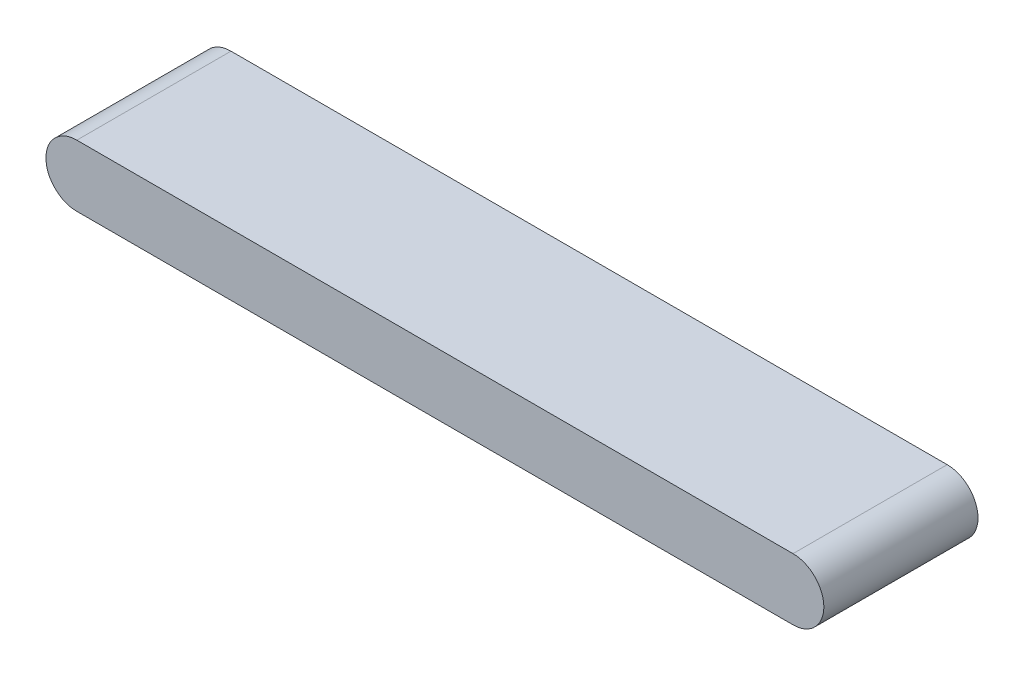
ISO-10303-21;
HEADER;
FILE_DESCRIPTION(('STEP AP214'),'2;1');
FILE_NAME('part.step','',(''),(''),'','','');
FILE_SCHEMA(('AUTOMOTIVE_DESIGN { 1 0 10303 214 1 1 1 1 }'));
ENDSEC;
DATA;
#1=APPLICATION_CONTEXT('core data for automotive mechanical design processes');
#2=APPLICATION_PROTOCOL_DEFINITION('international standard','automotive_design',2000,#1);
#3=PRODUCT_CONTEXT('',#1,'mechanical');
#4=PRODUCT('Part','Part','',(#3));
#5=PRODUCT_RELATED_PRODUCT_CATEGORY('part','',(#4));
#6=PRODUCT_DEFINITION_FORMATION('','',#4);
#7=PRODUCT_DEFINITION_CONTEXT('part definition',#1,'design');
#8=PRODUCT_DEFINITION('design','',#6,#7);
#9=PRODUCT_DEFINITION_SHAPE('','',#8);
#10=(LENGTH_UNIT() NAMED_UNIT(*) SI_UNIT(.MILLI.,.METRE.));
#11=(NAMED_UNIT(*) PLANE_ANGLE_UNIT() SI_UNIT($,.RADIAN.));
#12=(NAMED_UNIT(*) SI_UNIT($,.STERADIAN.) SOLID_ANGLE_UNIT());
#13=UNCERTAINTY_MEASURE_WITH_UNIT(LENGTH_MEASURE(1.E-05),#10,'distance_accuracy_value','');
#14=(GEOMETRIC_REPRESENTATION_CONTEXT(3) GLOBAL_UNCERTAINTY_ASSIGNED_CONTEXT((#13)) GLOBAL_UNIT_ASSIGNED_CONTEXT((#10,
#11,#12)) REPRESENTATION_CONTEXT('',''));
#15=CARTESIAN_POINT('',(0.,0.,0.));
#16=DIRECTION('',(0.,0.,1.));
#17=DIRECTION('',(1.,0.,0.));
#18=AXIS2_PLACEMENT_3D('',#15,#16,#17);
#19=CARTESIAN_POINT('',(145.46078625973,16.026778733944,1.974998392004));
#20=DIRECTION('',(-8.74227339409097E-08,0.,-1.));
#21=DIRECTION('',(-4.371138828674E-08,1.,0.));
#22=AXIS2_PLACEMENT_3D('',#19,#20,#21);
#23=CYLINDRICAL_SURFACE('',#22,0.15);
#24=CARTESIAN_POINT('',(145.46078625318,16.176778733944,1.97499839200438));
#25=CARTESIAN_POINT('',(145.398977588499,16.1767787312423,1.97499839740786));
#26=CARTESIAN_POINT('',(145.354720237919,16.1328447464892,1.97499840127696));
#27=CARTESIAN_POINT('',(145.311016089068,16.0894599215023,1.9749984050977));
#28=CARTESIAN_POINT('',(145.31078625973,16.0267787273906,1.97499840511779));
#29=CARTESIAN_POINT('',(145.31056046366,15.9651975234226,1.97499840513753));
#30=CARTESIAN_POINT('',(145.354720247187,15.9207127121309,1.97499840127696));
#31=CARTESIAN_POINT('',(145.398333224976,15.8767787312141,1.9749983974642));
#32=CARTESIAN_POINT('',(145.460786266287,15.876778733944,1.97499839200438));
#33=B_SPLINE_CURVE_WITH_KNOTS('',2,(#24,#25,#26,#27,#28,#29,#30,#31,#32),.UNSPECIFIED.,.F.,.F.,
(3,2,2,2,3),(0.,0.25,0.5,0.75,1.),.UNSPECIFIED.);
#34=CARTESIAN_POINT('',(145.460786253178,16.1767787339443,1.97499839200419));
#35=VERTEX_POINT('',#34);
#36=CARTESIAN_POINT('',(145.460786266289,15.8767787339443,1.97499839200419));
#37=VERTEX_POINT('',#36);
#38=EDGE_CURVE('E88',#35,#37,#33,.T.);
#39=ORIENTED_EDGE('',*,*,#38,.F.);
#40=CARTESIAN_POINT('',(145.460786253173,16.176778733944,1.974998392004));
#41=DIRECTION('',(-8.74227357172682E-08,0.,-0.999999999999996));
#42=VECTOR('',#41,1.);
#43=LINE('',#40,#42);
#44=CARTESIAN_POINT('',(145.460786187609,16.1767787339443,1.22499839200419));
#45=VERTEX_POINT('',#44);
#46=EDGE_CURVE('E64',#35,#45,#43,.T.);
#47=ORIENTED_EDGE('',*,*,#46,.T.);
#48=CARTESIAN_POINT('',(145.460786194163,16.026778733944,1.22499839200399));
#49=DIRECTION('',(8.74227339409097E-08,0.,1.));
#50=DIRECTION('',(-4.37113308511998E-08,0.999999999999999,0.));
#51=AXIS2_PLACEMENT_3D('',#48,#49,#50);
#52=CIRCLE('',#51,0.150000000000001);
#53=CARTESIAN_POINT('',(145.46078620072,15.8767787339443,1.22499839200419));
#54=VERTEX_POINT('',#53);
#55=EDGE_CURVE('E57',#45,#54,#52,.T.);
#56=ORIENTED_EDGE('',*,*,#55,.T.);
#57=CARTESIAN_POINT('',(145.460786200723,15.876778733944,1.224998392004));
#58=DIRECTION('',(8.74227357172682E-08,0.,0.999999999999996));
#59=VECTOR('',#58,1.);
#60=LINE('',#57,#59);
#61=EDGE_CURVE('E62',#54,#37,#60,.T.);
#62=ORIENTED_EDGE('',*,*,#61,.T.);
#63=EDGE_LOOP('',(#39,#47,#56,#62));
#64=FACE_BOUND('',#63,.T.);
#65=ADVANCED_FACE('F16',(#64),#23,.T.);
#66=CARTESIAN_POINT('',(148.94521602572,16.026778886254,1.224998087386));
#67=DIRECTION('',(8.74227339409097E-08,0.,1.));
#68=DIRECTION('',(4.37113882867345E-08,-1.,0.));
#69=AXIS2_PLACEMENT_3D('',#66,#67,#68);
#70=PLANE('',#69);
#71=CARTESIAN_POINT('',(148.94521603228,15.876778886254,1.224998087386));
#72=DIRECTION('',(-0.999999999999995,-4.37113884499558E-08,8.7422733960347E-08));
#73=VECTOR('',#72,1.);
#74=LINE('',#71,#73);
#75=CARTESIAN_POINT('',(148.94521603228,15.876778886254,1.224998087386));
#76=VERTEX_POINT('',#75);
#77=EDGE_CURVE('E73',#76,#54,#74,.T.);
#78=ORIENTED_EDGE('',*,*,#77,.T.);
#79=ORIENTED_EDGE('',*,*,#55,.F.);
#80=CARTESIAN_POINT('',(145.46078618761,16.1767787339447,1.22499839200438));
#81=DIRECTION('',(0.999999999999995,4.37113884500815E-08,-8.74227339605984E-08));
#82=VECTOR('',#81,1.);
#83=LINE('',#80,#82);
#84=CARTESIAN_POINT('',(148.945216019163,16.176778886254,1.224998087386));
#85=VERTEX_POINT('',#84);
#86=EDGE_CURVE('E207',#45,#85,#83,.T.);
#87=ORIENTED_EDGE('',*,*,#86,.T.);
#88=CARTESIAN_POINT('',(148.945216025723,16.026778886254,1.22499808738599));
#89=DIRECTION('',(8.74227339409097E-08,0.,1.));
#90=DIRECTION('',(4.36915318739274E-08,-0.999999999999999,0.));
#91=AXIS2_PLACEMENT_3D('',#88,#89,#90);
#92=CIRCLE('',#91,0.150000000000001);
#93=EDGE_CURVE('E77',#76,#85,#92,.T.);
#94=ORIENTED_EDGE('',*,*,#93,.F.);
#95=EDGE_LOOP('',(#78,#79,#87,#94));
#96=FACE_BOUND('',#95,.T.);
#97=ADVANCED_FACE('F75',(#96),#70,.F.);
#98=CARTESIAN_POINT('',(148.94521608473,16.176778886254,1.974998087386));
#99=DIRECTION('',(4.37113884112E-08,-1.,0.));
#100=DIRECTION('',(0.,0.,-1.));
#101=AXIS2_PLACEMENT_3D('',#98,#99,#100);
#102=PLANE('',#101);
#103=ORIENTED_EDGE('',*,*,#46,.F.);
#104=CARTESIAN_POINT('',(148.94521608473,16.176778886254,1.974998087386));
#105=DIRECTION('',(-0.999999999999995,-4.37113884500815E-08,8.74227339605984E-08));
#106=VECTOR('',#105,1.);
#107=LINE('',#104,#106);
#108=CARTESIAN_POINT('',(148.945216084731,16.176778886254,1.974998087386));
#109=VERTEX_POINT('',#108);
#110=EDGE_CURVE('E148',#109,#35,#107,.T.);
#111=ORIENTED_EDGE('',*,*,#110,.F.);
#112=CARTESIAN_POINT('',(148.945216019166,16.176778886254,1.224998087386));
#113=DIRECTION('',(8.74227357172682E-08,0.,0.999999999999996));
#114=VECTOR('',#113,1.);
#115=LINE('',#112,#114);
#116=EDGE_CURVE('E177',#85,#109,#115,.T.);
#117=ORIENTED_EDGE('',*,*,#116,.F.);
#118=ORIENTED_EDGE('',*,*,#86,.F.);
#119=EDGE_LOOP('',(#103,#111,#117,#118));
#120=FACE_BOUND('',#119,.T.);
#121=ADVANCED_FACE('F182',(#120),#102,.F.);
#122=CARTESIAN_POINT('',(148.94521609129,16.026778886254,1.974998087386));
#123=DIRECTION('',(8.74227339409097E-08,0.,1.));
#124=DIRECTION('',(4.37113882867345E-08,-1.,0.));
#125=AXIS2_PLACEMENT_3D('',#122,#123,#124);
#126=PLANE('',#125);
#127=ORIENTED_EDGE('',*,*,#38,.T.);
#128=CARTESIAN_POINT('',(145.46078626629,15.8767787339447,1.97499839200438));
#129=DIRECTION('',(0.999999999999995,4.37113884499558E-08,-8.7422733960347E-08));
#130=VECTOR('',#129,1.);
#131=LINE('',#128,#130);
#132=CARTESIAN_POINT('',(148.945216097849,15.876778886254,1.974998087386));
#133=VERTEX_POINT('',#132);
#134=EDGE_CURVE('E36',#37,#133,#131,.T.);
#135=ORIENTED_EDGE('',*,*,#134,.T.);
#136=CARTESIAN_POINT('',(148.94521609129,16.026778886254,1.974998087386));
#137=DIRECTION('',(-8.74227339409097E-08,0.,-1.));
#138=DIRECTION('',(-4.37113308511998E-08,0.999999999999999,0.));
#139=AXIS2_PLACEMENT_3D('',#136,#137,#138);
#140=CIRCLE('',#139,0.150000000000001);
#141=EDGE_CURVE('E28',#109,#133,#140,.T.);
#142=ORIENTED_EDGE('',*,*,#141,.F.);
#143=ORIENTED_EDGE('',*,*,#110,.T.);
#144=EDGE_LOOP('',(#127,#135,#142,#143));
#145=FACE_BOUND('',#144,.T.);
#146=ADVANCED_FACE('F108',(#145),#126,.T.);
#147=CARTESIAN_POINT('',(148.94521609785,15.876778886254,1.974998087386));
#148=DIRECTION('',(-4.37113884112E-08,1.,0.));
#149=DIRECTION('',(0.,0.,1.));
#150=AXIS2_PLACEMENT_3D('',#147,#148,#149);
#151=PLANE('',#150);
#152=CARTESIAN_POINT('',(148.94521609785,15.876778886254,1.974998087386));
#153=DIRECTION('',(-8.74227357172682E-08,0.,-0.999999999999996));
#154=VECTOR('',#153,1.);
#155=LINE('',#152,#154);
#156=EDGE_CURVE('E11',#133,#76,#155,.T.);
#157=ORIENTED_EDGE('',*,*,#156,.F.);
#158=ORIENTED_EDGE('',*,*,#134,.F.);
#159=ORIENTED_EDGE('',*,*,#61,.F.);
#160=ORIENTED_EDGE('',*,*,#77,.F.);
#161=EDGE_LOOP('',(#157,#158,#159,#160));
#162=FACE_BOUND('',#161,.T.);
#163=ADVANCED_FACE('F85',(#162),#151,.F.);
#164=CARTESIAN_POINT('',(148.94521609129,16.026778886254,1.974998087386));
#165=DIRECTION('',(-8.74227339409097E-08,0.,-1.));
#166=DIRECTION('',(-4.371138828674E-08,1.,0.));
#167=AXIS2_PLACEMENT_3D('',#164,#165,#166);
#168=CYLINDRICAL_SURFACE('',#167,0.15);
#169=ORIENTED_EDGE('',*,*,#141,.T.);
#170=ORIENTED_EDGE('',*,*,#156,.T.);
#171=ORIENTED_EDGE('',*,*,#93,.T.);
#172=ORIENTED_EDGE('',*,*,#116,.T.);
#173=EDGE_LOOP('',(#169,#170,#171,#172));
#174=FACE_BOUND('',#173,.T.);
#175=ADVANCED_FACE('F107',(#174),#168,.T.);
#176=CLOSED_SHELL('',(#65,#97,#121,#146,#163,#175));
#177=MANIFOLD_SOLID_BREP('B1',#176);
#178=ADVANCED_BREP_SHAPE_REPRESENTATION('',(#18,#177),#14);
#179=SHAPE_DEFINITION_REPRESENTATION(#9,#178);
ENDSEC;
END-ISO-10303-21;
